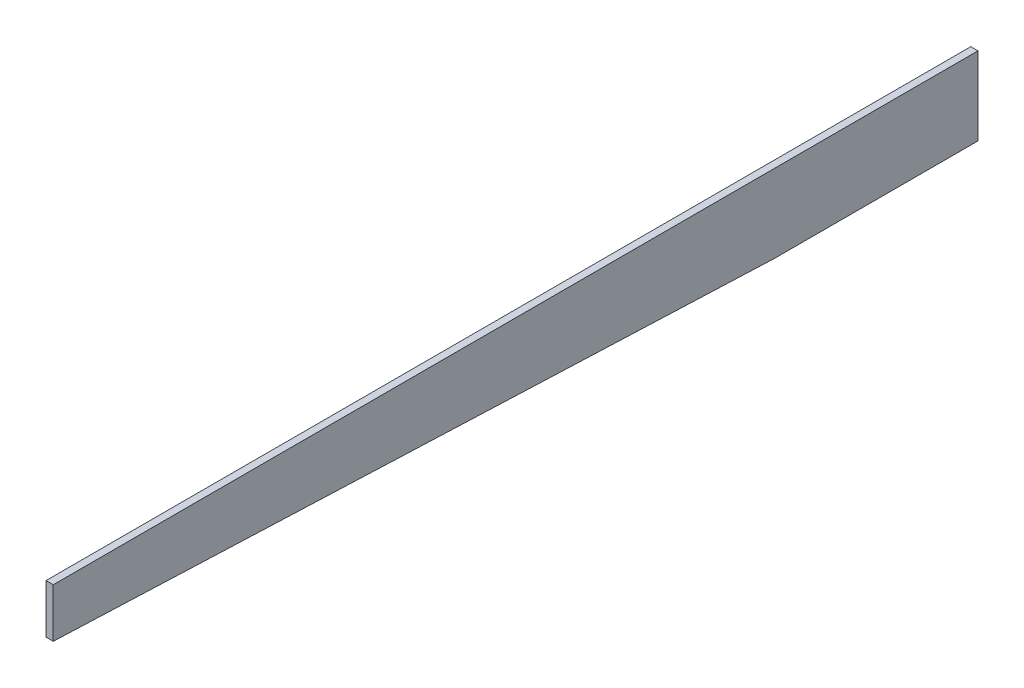
ISO-10303-21;
HEADER;
FILE_DESCRIPTION(('STEP AP214'),'2;1');
FILE_NAME('part.step','',(''),(''),'','','');
FILE_SCHEMA(('AUTOMOTIVE_DESIGN { 1 0 10303 214 1 1 1 1 }'));
ENDSEC;
DATA;
#1=APPLICATION_CONTEXT('core data for automotive mechanical design processes');
#2=APPLICATION_PROTOCOL_DEFINITION('international standard','automotive_design',2000,#1);
#3=PRODUCT_CONTEXT('',#1,'mechanical');
#4=PRODUCT('Part','Part','',(#3));
#5=PRODUCT_RELATED_PRODUCT_CATEGORY('part','',(#4));
#6=PRODUCT_DEFINITION_FORMATION('','',#4);
#7=PRODUCT_DEFINITION_CONTEXT('part definition',#1,'design');
#8=PRODUCT_DEFINITION('design','',#6,#7);
#9=PRODUCT_DEFINITION_SHAPE('','',#8);
#10=(LENGTH_UNIT() NAMED_UNIT(*) SI_UNIT(.MILLI.,.METRE.));
#11=(NAMED_UNIT(*) PLANE_ANGLE_UNIT() SI_UNIT($,.RADIAN.));
#12=(NAMED_UNIT(*) SI_UNIT($,.STERADIAN.) SOLID_ANGLE_UNIT());
#13=UNCERTAINTY_MEASURE_WITH_UNIT(LENGTH_MEASURE(1.E-05),#10,'distance_accuracy_value','');
#14=(GEOMETRIC_REPRESENTATION_CONTEXT(3) GLOBAL_UNCERTAINTY_ASSIGNED_CONTEXT((#13)) GLOBAL_UNIT_ASSIGNED_CONTEXT((#10,
#11,#12)) REPRESENTATION_CONTEXT('',''));
#15=CARTESIAN_POINT('',(0.,0.,0.));
#16=DIRECTION('',(0.,0.,1.));
#17=DIRECTION('',(1.,0.,0.));
#18=AXIS2_PLACEMENT_3D('',#15,#16,#17);
#19=CARTESIAN_POINT('',(3.,0.,84.3));
#20=DIRECTION('',(0.,1.,0.));
#21=DIRECTION('',(0.,0.,1.));
#22=AXIS2_PLACEMENT_3D('',#19,#20,#21);
#23=PLANE('',#22);
#24=DIRECTION('',(0.,0.,-1.));
#25=VECTOR('',#24,1.);
#26=CARTESIAN_POINT('',(0.,0.,84.3));
#27=LINE('',#26,#25);
#28=CARTESIAN_POINT('',(0.,0.,84.3));
#29=VERTEX_POINT('',#28);
#30=CARTESIAN_POINT('',(0.,0.,0.));
#31=VERTEX_POINT('',#30);
#32=EDGE_CURVE('E111',#29,#31,#27,.T.);
#33=ORIENTED_EDGE('',*,*,#32,.T.);
#34=DIRECTION('',(-1.,0.,0.));
#35=VECTOR('',#34,1.);
#36=CARTESIAN_POINT('',(3.,0.,0.));
#37=LINE('',#36,#35);
#38=CARTESIAN_POINT('',(3.,0.,0.));
#39=VERTEX_POINT('',#38);
#40=EDGE_CURVE('E11',#39,#31,#37,.T.);
#41=ORIENTED_EDGE('',*,*,#40,.F.);
#42=DIRECTION('',(0.,0.,-1.));
#43=VECTOR('',#42,1.);
#44=CARTESIAN_POINT('',(3.,0.,84.3));
#45=LINE('',#44,#43);
#46=CARTESIAN_POINT('',(3.,0.,84.3));
#47=VERTEX_POINT('',#46);
#48=EDGE_CURVE('E119',#47,#39,#45,.T.);
#49=ORIENTED_EDGE('',*,*,#48,.F.);
#50=DIRECTION('',(-1.,0.,0.));
#51=VECTOR('',#50,1.);
#52=CARTESIAN_POINT('',(3.,0.,84.3));
#53=LINE('',#52,#51);
#54=EDGE_CURVE('E107',#47,#29,#53,.T.);
#55=ORIENTED_EDGE('',*,*,#54,.T.);
#56=EDGE_LOOP('',(#33,#41,#49,#55));
#57=FACE_BOUND('',#56,.T.);
#58=ADVANCED_FACE('F37',(#57),#23,.F.);
#59=CARTESIAN_POINT('',(3.,0.,0.));
#60=DIRECTION('',(0.,0.,1.));
#61=DIRECTION('',(1.,0.,0.));
#62=AXIS2_PLACEMENT_3D('',#59,#60,#61);
#63=PLANE('',#62);
#64=DIRECTION('',(0.,1.,0.));
#65=VECTOR('',#64,1.);
#66=CARTESIAN_POINT('',(0.,0.,0.));
#67=LINE('',#66,#65);
#68=CARTESIAN_POINT('',(0.,32.31,0.));
#69=VERTEX_POINT('',#68);
#70=EDGE_CURVE('E114',#31,#69,#67,.T.);
#71=ORIENTED_EDGE('',*,*,#70,.T.);
#72=DIRECTION('',(-1.,0.,0.));
#73=VECTOR('',#72,1.);
#74=CARTESIAN_POINT('',(3.,32.31,0.));
#75=LINE('',#74,#73);
#76=CARTESIAN_POINT('',(3.,32.31,0.));
#77=VERTEX_POINT('',#76);
#78=EDGE_CURVE('E45',#77,#69,#75,.T.);
#79=ORIENTED_EDGE('',*,*,#78,.F.);
#80=DIRECTION('',(0.,1.,0.));
#81=VECTOR('',#80,1.);
#82=CARTESIAN_POINT('',(3.,0.,0.));
#83=LINE('',#82,#81);
#84=EDGE_CURVE('E87',#39,#77,#83,.T.);
#85=ORIENTED_EDGE('',*,*,#84,.F.);
#86=ORIENTED_EDGE('',*,*,#40,.T.);
#87=EDGE_LOOP('',(#71,#79,#85,#86));
#88=FACE_BOUND('',#87,.T.);
#89=ADVANCED_FACE('F138',(#88),#63,.F.);
#90=CARTESIAN_POINT('',(3.,32.31,0.));
#91=DIRECTION('',(0.,-1.,0.));
#92=DIRECTION('',(0.,0.,-1.));
#93=AXIS2_PLACEMENT_3D('',#90,#91,#92);
#94=PLANE('',#93);
#95=DIRECTION('',(0.,0.,1.));
#96=VECTOR('',#95,1.);
#97=CARTESIAN_POINT('',(0.,32.31,0.));
#98=LINE('',#97,#96);
#99=CARTESIAN_POINT('',(0.,32.31,383.));
#100=VERTEX_POINT('',#99);
#101=EDGE_CURVE('E102',#69,#100,#98,.T.);
#102=ORIENTED_EDGE('',*,*,#101,.T.);
#103=DIRECTION('',(-1.,0.,0.));
#104=VECTOR('',#103,1.);
#105=CARTESIAN_POINT('',(3.,32.31,383.));
#106=LINE('',#105,#104);
#107=CARTESIAN_POINT('',(3.,32.31,383.));
#108=VERTEX_POINT('',#107);
#109=EDGE_CURVE('E99',#108,#100,#106,.T.);
#110=ORIENTED_EDGE('',*,*,#109,.F.);
#111=DIRECTION('',(0.,0.,1.));
#112=VECTOR('',#111,1.);
#113=CARTESIAN_POINT('',(3.,32.31,0.));
#114=LINE('',#113,#112);
#115=EDGE_CURVE('E91',#77,#108,#114,.T.);
#116=ORIENTED_EDGE('',*,*,#115,.F.);
#117=ORIENTED_EDGE('',*,*,#78,.T.);
#118=EDGE_LOOP('',(#102,#110,#116,#117));
#119=FACE_BOUND('',#118,.T.);
#120=ADVANCED_FACE('F100',(#119),#94,.F.);
#121=CARTESIAN_POINT('',(3.,32.31,383.));
#122=DIRECTION('',(0.,0.,-1.));
#123=DIRECTION('',(-1.,0.,0.));
#124=AXIS2_PLACEMENT_3D('',#121,#122,#123);
#125=PLANE('',#124);
#126=DIRECTION('',(0.,-1.,0.));
#127=VECTOR('',#126,1.);
#128=CARTESIAN_POINT('',(0.,32.31,383.));
#129=LINE('',#128,#127);
#130=CARTESIAN_POINT('',(0.,12.0163300653595,383.));
#131=VERTEX_POINT('',#130);
#132=EDGE_CURVE('E73',#100,#131,#129,.T.);
#133=ORIENTED_EDGE('',*,*,#132,.T.);
#134=DIRECTION('',(-1.,0.,0.));
#135=VECTOR('',#134,1.);
#136=CARTESIAN_POINT('',(3.,12.0163300653595,383.));
#137=LINE('',#136,#135);
#138=CARTESIAN_POINT('',(3.,12.0163300653595,383.));
#139=VERTEX_POINT('',#138);
#140=EDGE_CURVE('E103',#139,#131,#137,.T.);
#141=ORIENTED_EDGE('',*,*,#140,.F.);
#142=DIRECTION('',(0.,-1.,0.));
#143=VECTOR('',#142,1.);
#144=CARTESIAN_POINT('',(3.,32.31,383.));
#145=LINE('',#144,#143);
#146=EDGE_CURVE('E95',#108,#139,#145,.T.);
#147=ORIENTED_EDGE('',*,*,#146,.F.);
#148=ORIENTED_EDGE('',*,*,#109,.T.);
#149=EDGE_LOOP('',(#133,#141,#147,#148));
#150=FACE_BOUND('',#149,.T.);
#151=ADVANCED_FACE('F105',(#150),#125,.F.);
#152=CARTESIAN_POINT('',(3.,12.0163300653595,383.));
#153=DIRECTION('',(0.,0.999191804335264,-0.040196245461984));
#154=DIRECTION('',(0.,0.040196245461984,0.999191804335264));
#155=AXIS2_PLACEMENT_3D('',#152,#153,#154);
#156=PLANE('',#155);
#157=DIRECTION('',(0.,-0.040196245461984,-0.999191804335264));
#158=VECTOR('',#157,1.);
#159=CARTESIAN_POINT('',(0.,12.0163300653595,383.));
#160=LINE('',#159,#158);
#161=EDGE_CURVE('E79',#131,#29,#160,.T.);
#162=ORIENTED_EDGE('',*,*,#161,.T.);
#163=ORIENTED_EDGE('',*,*,#54,.F.);
#164=DIRECTION('',(0.,-0.040196245461984,-0.999191804335264));
#165=VECTOR('',#164,1.);
#166=CARTESIAN_POINT('',(3.,12.0163300653595,383.));
#167=LINE('',#166,#165);
#168=EDGE_CURVE('E53',#139,#47,#167,.T.);
#169=ORIENTED_EDGE('',*,*,#168,.F.);
#170=ORIENTED_EDGE('',*,*,#140,.T.);
#171=EDGE_LOOP('',(#162,#163,#169,#170));
#172=FACE_BOUND('',#171,.T.);
#173=ADVANCED_FACE('F127',(#172),#156,.F.);
#174=CARTESIAN_POINT('',(3.,0.,0.));
#175=DIRECTION('',(1.,0.,0.));
#176=DIRECTION('',(0.,0.,-1.));
#177=AXIS2_PLACEMENT_3D('',#174,#175,#176);
#178=PLANE('',#177);
#179=ORIENTED_EDGE('',*,*,#48,.T.);
#180=ORIENTED_EDGE('',*,*,#84,.T.);
#181=ORIENTED_EDGE('',*,*,#115,.T.);
#182=ORIENTED_EDGE('',*,*,#146,.T.);
#183=ORIENTED_EDGE('',*,*,#168,.T.);
#184=EDGE_LOOP('',(#179,#180,#181,#182,#183));
#185=FACE_BOUND('',#184,.T.);
#186=ADVANCED_FACE('F93',(#185),#178,.T.);
#187=CARTESIAN_POINT('',(0.,0.,0.));
#188=DIRECTION('',(1.,0.,0.));
#189=DIRECTION('',(0.,0.,-1.));
#190=AXIS2_PLACEMENT_3D('',#187,#188,#189);
#191=PLANE('',#190);
#192=ORIENTED_EDGE('',*,*,#32,.F.);
#193=ORIENTED_EDGE('',*,*,#161,.F.);
#194=ORIENTED_EDGE('',*,*,#132,.F.);
#195=ORIENTED_EDGE('',*,*,#101,.F.);
#196=ORIENTED_EDGE('',*,*,#70,.F.);
#197=EDGE_LOOP('',(#192,#193,#194,#195,#196));
#198=FACE_BOUND('',#197,.T.);
#199=ADVANCED_FACE('F123',(#198),#191,.F.);
#200=CLOSED_SHELL('',(#58,#89,#120,#151,#173,#186,#199));
#201=MANIFOLD_SOLID_BREP('B2',#200);
#202=ADVANCED_BREP_SHAPE_REPRESENTATION('',(#18,#201),#14);
#203=SHAPE_DEFINITION_REPRESENTATION(#9,#202);
ENDSEC;
END-ISO-10303-21;
